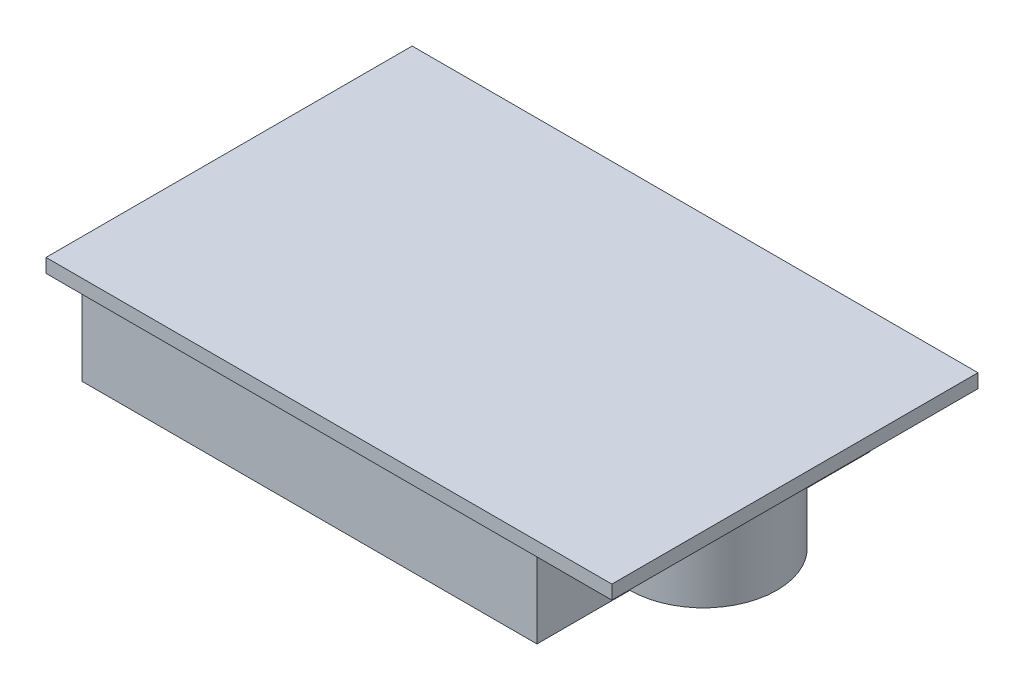
ISO-10303-21;
HEADER;
FILE_DESCRIPTION(('STEP AP214'),'2;1');
FILE_NAME('part.step','',(''),(''),'','','');
FILE_SCHEMA(('AUTOMOTIVE_DESIGN { 1 0 10303 214 1 1 1 1 }'));
ENDSEC;
DATA;
#1=APPLICATION_CONTEXT('core data for automotive mechanical design processes');
#2=APPLICATION_PROTOCOL_DEFINITION('international standard','automotive_design',2000,#1);
#3=PRODUCT_CONTEXT('',#1,'mechanical');
#4=PRODUCT('Part','Part','',(#3));
#5=PRODUCT_RELATED_PRODUCT_CATEGORY('part','',(#4));
#6=PRODUCT_DEFINITION_FORMATION('','',#4);
#7=PRODUCT_DEFINITION_CONTEXT('part definition',#1,'design');
#8=PRODUCT_DEFINITION('design','',#6,#7);
#9=PRODUCT_DEFINITION_SHAPE('','',#8);
#10=(LENGTH_UNIT() NAMED_UNIT(*) SI_UNIT(.MILLI.,.METRE.));
#11=(NAMED_UNIT(*) PLANE_ANGLE_UNIT() SI_UNIT($,.RADIAN.));
#12=(NAMED_UNIT(*) SI_UNIT($,.STERADIAN.) SOLID_ANGLE_UNIT());
#13=UNCERTAINTY_MEASURE_WITH_UNIT(LENGTH_MEASURE(1.E-05),#10,'distance_accuracy_value','');
#14=(GEOMETRIC_REPRESENTATION_CONTEXT(3) GLOBAL_UNCERTAINTY_ASSIGNED_CONTEXT((#13)) GLOBAL_UNIT_ASSIGNED_CONTEXT((#10,
#11,#12)) REPRESENTATION_CONTEXT('',''));
#15=CARTESIAN_POINT('',(0.,0.,0.));
#16=DIRECTION('',(0.,0.,1.));
#17=DIRECTION('',(1.,0.,0.));
#18=AXIS2_PLACEMENT_3D('',#15,#16,#17);
#19=CARTESIAN_POINT('',(-29.3159609120521,16.6,4.20195439739414));
#20=DIRECTION('',(1.,0.,0.));
#21=DIRECTION('',(0.,0.,-1.));
#22=AXIS2_PLACEMENT_3D('',#19,#20,#21);
#23=PLANE('',#22);
#24=DIRECTION('',(0.,0.,1.));
#25=VECTOR('',#24,1.);
#26=CARTESIAN_POINT('',(-29.3159609120521,0.,4.20195439739414));
#27=LINE('',#26,#25);
#28=CARTESIAN_POINT('',(-29.3159609120521,0.,-55.7980456026059));
#29=VERTEX_POINT('',#28);
#30=CARTESIAN_POINT('',(-29.3159609120521,0.,4.20195439739414));
#31=VERTEX_POINT('',#30);
#32=EDGE_CURVE('E136',#29,#31,#27,.T.);
#33=ORIENTED_EDGE('',*,*,#32,.T.);
#34=DIRECTION('',(0.,-1.,0.));
#35=VECTOR('',#34,1.);
#36=CARTESIAN_POINT('',(-29.3159609120521,16.6,4.20195439739414));
#37=LINE('',#36,#35);
#38=CARTESIAN_POINT('',(-29.3159609120521,16.6,4.20195439739414));
#39=VERTEX_POINT('',#38);
#40=EDGE_CURVE('E11',#39,#31,#37,.T.);
#41=ORIENTED_EDGE('',*,*,#40,.F.);
#42=DIRECTION('',(0.,0.,1.));
#43=VECTOR('',#42,1.);
#44=CARTESIAN_POINT('',(-29.3159609120521,16.6,4.20195439739414));
#45=LINE('',#44,#43);
#46=CARTESIAN_POINT('',(-29.3159609120521,16.6,-55.7980456026059));
#47=VERTEX_POINT('',#46);
#48=EDGE_CURVE('E128',#47,#39,#45,.T.);
#49=ORIENTED_EDGE('',*,*,#48,.F.);
#50=DIRECTION('',(0.,-1.,0.));
#51=VECTOR('',#50,1.);
#52=CARTESIAN_POINT('',(-29.3159609120521,16.6,-55.7980456026059));
#53=LINE('',#52,#51);
#54=EDGE_CURVE('E135',#47,#29,#53,.T.);
#55=ORIENTED_EDGE('',*,*,#54,.T.);
#56=EDGE_LOOP('',(#33,#41,#49,#55));
#57=FACE_BOUND('',#56,.T.);
#58=ADVANCED_FACE('F36',(#57),#23,.F.);
#59=CARTESIAN_POINT('',(-29.3159609120521,16.6,4.20195439739414));
#60=DIRECTION('',(0.,0.,-1.));
#61=DIRECTION('',(-1.,0.,0.));
#62=AXIS2_PLACEMENT_3D('',#59,#60,#61);
#63=PLANE('',#62);
#64=DIRECTION('',(1.,0.,0.));
#65=VECTOR('',#64,1.);
#66=CARTESIAN_POINT('',(-29.3159609120521,0.,4.20195439739414));
#67=LINE('',#66,#65);
#68=CARTESIAN_POINT('',(52.6840390879479,0.,4.20195439739414));
#69=VERTEX_POINT('',#68);
#70=EDGE_CURVE('E139',#31,#69,#67,.T.);
#71=ORIENTED_EDGE('',*,*,#70,.T.);
#72=DIRECTION('',(0.,-1.,0.));
#73=VECTOR('',#72,1.);
#74=CARTESIAN_POINT('',(52.6840390879479,16.6,4.20195439739414));
#75=LINE('',#74,#73);
#76=CARTESIAN_POINT('',(52.6840390879479,16.6,4.20195439739414));
#77=VERTEX_POINT('',#76);
#78=EDGE_CURVE('E43',#77,#69,#75,.T.);
#79=ORIENTED_EDGE('',*,*,#78,.F.);
#80=DIRECTION('',(1.,0.,0.));
#81=VECTOR('',#80,1.);
#82=CARTESIAN_POINT('',(-29.3159609120521,16.6,4.20195439739414));
#83=LINE('',#82,#81);
#84=EDGE_CURVE('E94',#39,#77,#83,.T.);
#85=ORIENTED_EDGE('',*,*,#84,.F.);
#86=ORIENTED_EDGE('',*,*,#40,.T.);
#87=EDGE_LOOP('',(#71,#79,#85,#86));
#88=FACE_BOUND('',#87,.T.);
#89=ADVANCED_FACE('F294',(#88),#63,.F.);
#90=CARTESIAN_POINT('',(52.6840390879479,16.6,-12.5480456026059));
#91=DIRECTION('',(-1.,0.,0.));
#92=DIRECTION('',(0.,0.,1.));
#93=AXIS2_PLACEMENT_3D('',#90,#91,#92);
#94=PLANE('',#93);
#95=DIRECTION('',(0.,0.,-1.));
#96=VECTOR('',#95,1.);
#97=CARTESIAN_POINT('',(52.6840390879479,0.,-12.5480456026059));
#98=LINE('',#97,#96);
#99=CARTESIAN_POINT('',(52.6840390879479,0.,-12.5480456026059));
#100=VERTEX_POINT('',#99);
#101=EDGE_CURVE('E110',#69,#100,#98,.T.);
#102=ORIENTED_EDGE('',*,*,#101,.T.);
#103=DIRECTION('',(0.,-1.,0.));
#104=VECTOR('',#103,1.);
#105=CARTESIAN_POINT('',(52.6840390879479,16.6,-12.5480456026059));
#106=LINE('',#105,#104);
#107=CARTESIAN_POINT('',(52.6840390879479,16.6,-12.5480456026059));
#108=VERTEX_POINT('',#107);
#109=EDGE_CURVE('E103',#108,#100,#106,.T.);
#110=ORIENTED_EDGE('',*,*,#109,.F.);
#111=DIRECTION('',(0.,0.,-1.));
#112=VECTOR('',#111,1.);
#113=CARTESIAN_POINT('',(52.6840390879479,16.6,-12.5480456026059));
#114=LINE('',#113,#112);
#115=EDGE_CURVE('E108',#77,#108,#114,.T.);
#116=ORIENTED_EDGE('',*,*,#115,.F.);
#117=ORIENTED_EDGE('',*,*,#78,.T.);
#118=EDGE_LOOP('',(#102,#110,#116,#117));
#119=FACE_BOUND('',#118,.T.);
#120=ADVANCED_FACE('F105',(#119),#94,.F.);
#121=CARTESIAN_POINT('',(52.6840390879479,16.6,-25.7980456026059));
#122=DIRECTION('',(0.,-1.,0.));
#123=DIRECTION('',(0.,0.,-1.));
#124=AXIS2_PLACEMENT_3D('',#121,#122,#123);
#125=CYLINDRICAL_SURFACE('',#124,13.25);
#126=CARTESIAN_POINT('',(52.6840390879479,0.,-25.7980456026059));
#127=DIRECTION('',(0.,1.,0.));
#128=DIRECTION('',(0.,0.,1.));
#129=AXIS2_PLACEMENT_3D('',#126,#127,#128);
#130=CIRCLE('',#129,13.25);
#131=CARTESIAN_POINT('',(52.6840390879479,0.,-39.0480456026059));
#132=VERTEX_POINT('',#131);
#133=EDGE_CURVE('E143',#100,#132,#130,.T.);
#134=ORIENTED_EDGE('',*,*,#133,.T.);
#135=DIRECTION('',(0.,-1.,0.));
#136=VECTOR('',#135,1.);
#137=CARTESIAN_POINT('',(52.6840390879479,16.6,-39.0480456026059));
#138=LINE('',#137,#136);
#139=CARTESIAN_POINT('',(52.6840390879479,16.6,-39.0480456026059));
#140=VERTEX_POINT('',#139);
#141=EDGE_CURVE('E113',#140,#132,#138,.T.);
#142=ORIENTED_EDGE('',*,*,#141,.F.);
#143=CARTESIAN_POINT('',(52.6840390879479,16.6,-25.7980456026059));
#144=DIRECTION('',(0.,1.,0.));
#145=DIRECTION('',(0.,0.,1.));
#146=AXIS2_PLACEMENT_3D('',#143,#144,#145);
#147=CIRCLE('',#146,13.25);
#148=EDGE_CURVE('E116',#108,#140,#147,.T.);
#149=ORIENTED_EDGE('',*,*,#148,.F.);
#150=ORIENTED_EDGE('',*,*,#109,.T.);
#151=EDGE_LOOP('',(#134,#142,#149,#150));
#152=FACE_BOUND('',#151,.T.);
#153=ADVANCED_FACE('F117',(#152),#125,.T.);
#154=CARTESIAN_POINT('',(52.6840390879479,16.6,-55.7980456026059));
#155=DIRECTION('',(-1.,0.,0.));
#156=DIRECTION('',(0.,0.,1.));
#157=AXIS2_PLACEMENT_3D('',#154,#155,#156);
#158=PLANE('',#157);
#159=DIRECTION('',(0.,0.,-1.));
#160=VECTOR('',#159,1.);
#161=CARTESIAN_POINT('',(52.6840390879479,0.,-55.7980456026059));
#162=LINE('',#161,#160);
#163=CARTESIAN_POINT('',(52.6840390879479,0.,-55.7980456026059));
#164=VERTEX_POINT('',#163);
#165=EDGE_CURVE('E145',#132,#164,#162,.T.);
#166=ORIENTED_EDGE('',*,*,#165,.T.);
#167=DIRECTION('',(0.,-1.,0.));
#168=VECTOR('',#167,1.);
#169=CARTESIAN_POINT('',(52.6840390879479,16.6,-55.7980456026059));
#170=LINE('',#169,#168);
#171=CARTESIAN_POINT('',(52.6840390879479,16.6,-55.7980456026059));
#172=VERTEX_POINT('',#171);
#173=EDGE_CURVE('E59',#172,#164,#170,.T.);
#174=ORIENTED_EDGE('',*,*,#173,.F.);
#175=DIRECTION('',(0.,0.,-1.));
#176=VECTOR('',#175,1.);
#177=CARTESIAN_POINT('',(52.6840390879479,16.6,-55.7980456026059));
#178=LINE('',#177,#176);
#179=EDGE_CURVE('E121',#140,#172,#178,.T.);
#180=ORIENTED_EDGE('',*,*,#179,.F.);
#181=ORIENTED_EDGE('',*,*,#141,.T.);
#182=EDGE_LOOP('',(#166,#174,#180,#181));
#183=FACE_BOUND('',#182,.T.);
#184=ADVANCED_FACE('F154',(#183),#158,.F.);
#185=CARTESIAN_POINT('',(-29.3159609120521,16.6,-55.7980456026059));
#186=DIRECTION('',(0.,0.,1.));
#187=DIRECTION('',(1.,0.,0.));
#188=AXIS2_PLACEMENT_3D('',#185,#186,#187);
#189=PLANE('',#188);
#190=DIRECTION('',(-1.,0.,0.));
#191=VECTOR('',#190,1.);
#192=CARTESIAN_POINT('',(-29.3159609120521,0.,-55.7980456026059));
#193=LINE('',#192,#191);
#194=EDGE_CURVE('E86',#164,#29,#193,.T.);
#195=ORIENTED_EDGE('',*,*,#194,.T.);
#196=ORIENTED_EDGE('',*,*,#54,.F.);
#197=DIRECTION('',(-1.,0.,0.));
#198=VECTOR('',#197,1.);
#199=CARTESIAN_POINT('',(-29.3159609120521,16.6,-55.7980456026059));
#200=LINE('',#199,#198);
#201=EDGE_CURVE('E133',#172,#47,#200,.T.);
#202=ORIENTED_EDGE('',*,*,#201,.F.);
#203=ORIENTED_EDGE('',*,*,#173,.T.);
#204=EDGE_LOOP('',(#195,#196,#202,#203));
#205=FACE_BOUND('',#204,.T.);
#206=ADVANCED_FACE('F157',(#205),#189,.F.);
#207=CARTESIAN_POINT('',(52.6840390879479,0.,-25.7980456026059));
#208=DIRECTION('',(0.,1.,0.));
#209=DIRECTION('',(0.,0.,1.));
#210=AXIS2_PLACEMENT_3D('',#207,#208,#209);
#211=PLANE('',#210);
#212=DIRECTION('',(1.,0.,0.));
#213=VECTOR('',#212,1.);
#214=CARTESIAN_POINT('',(-21.7678362246545,0.,-42.8510472899006));
#215=LINE('',#214,#213);
#216=CARTESIAN_POINT('',(-21.7678362246545,0.,-42.8510472899006));
#217=VERTEX_POINT('',#216);
#218=CARTESIAN_POINT('',(-2.15220219228129,0.,-42.8510472899006));
#219=VERTEX_POINT('',#218);
#220=EDGE_CURVE('E213',#217,#219,#215,.T.);
#221=ORIENTED_EDGE('',*,*,#220,.F.);
#222=DIRECTION('',(0.,0.,-1.));
#223=VECTOR('',#222,1.);
#224=CARTESIAN_POINT('',(-21.7678362246545,0.,-11.3977772317213));
#225=LINE('',#224,#223);
#226=CARTESIAN_POINT('',(-21.7678362246545,0.,-11.3977772317213));
#227=VERTEX_POINT('',#226);
#228=EDGE_CURVE('E50',#227,#217,#225,.T.);
#229=ORIENTED_EDGE('',*,*,#228,.F.);
#230=DIRECTION('',(-1.,0.,0.));
#231=VECTOR('',#230,1.);
#232=CARTESIAN_POINT('',(-21.7678362246545,0.,-11.3977772317213));
#233=LINE('',#232,#231);
#234=CARTESIAN_POINT('',(-2.15220219228129,0.,-11.3977772317213));
#235=VERTEX_POINT('',#234);
#236=EDGE_CURVE('E206',#235,#227,#233,.T.);
#237=ORIENTED_EDGE('',*,*,#236,.F.);
#238=DIRECTION('',(0.,0.,1.));
#239=VECTOR('',#238,1.);
#240=CARTESIAN_POINT('',(-2.15220219228129,0.,-11.3977772317213));
#241=LINE('',#240,#239);
#242=EDGE_CURVE('E210',#219,#235,#241,.T.);
#243=ORIENTED_EDGE('',*,*,#242,.F.);
#244=EDGE_LOOP('',(#221,#229,#237,#243));
#245=FACE_BOUND('',#244,.T.);
#246=ORIENTED_EDGE('',*,*,#32,.F.);
#247=ORIENTED_EDGE('',*,*,#194,.F.);
#248=ORIENTED_EDGE('',*,*,#165,.F.);
#249=ORIENTED_EDGE('',*,*,#133,.F.);
#250=ORIENTED_EDGE('',*,*,#101,.F.);
#251=ORIENTED_EDGE('',*,*,#70,.F.);
#252=EDGE_LOOP('',(#246,#247,#248,#249,#250,#251));
#253=FACE_BOUND('',#252,.T.);
#254=ADVANCED_FACE('F152',(#245,#253),#211,.F.);
#255=CARTESIAN_POINT('',(69.1840390879479,19.1,7.20195439739415));
#256=DIRECTION('',(0.,0.,-1.));
#257=DIRECTION('',(-1.,0.,0.));
#258=AXIS2_PLACEMENT_3D('',#255,#256,#257);
#259=PLANE('',#258);
#260=DIRECTION('',(1.,0.,0.));
#261=VECTOR('',#260,1.);
#262=CARTESIAN_POINT('',(69.1840390879479,16.6,7.20195439739415));
#263=LINE('',#262,#261);
#264=CARTESIAN_POINT('',(-32.8159609120521,16.6,7.20195439739415));
#265=VERTEX_POINT('',#264);
#266=CARTESIAN_POINT('',(69.1840390879479,16.6,7.20195439739415));
#267=VERTEX_POINT('',#266);
#268=EDGE_CURVE('E182',#265,#267,#263,.T.);
#269=ORIENTED_EDGE('',*,*,#268,.T.);
#270=DIRECTION('',(0.,-1.,0.));
#271=VECTOR('',#270,1.);
#272=CARTESIAN_POINT('',(69.1840390879479,19.1,7.20195439739415));
#273=LINE('',#272,#271);
#274=CARTESIAN_POINT('',(69.1840390879479,19.1,7.20195439739415));
#275=VERTEX_POINT('',#274);
#276=EDGE_CURVE('E140',#275,#267,#273,.T.);
#277=ORIENTED_EDGE('',*,*,#276,.F.);
#278=DIRECTION('',(1.,0.,0.));
#279=VECTOR('',#278,1.);
#280=CARTESIAN_POINT('',(69.1840390879479,19.1,7.20195439739415));
#281=LINE('',#280,#279);
#282=CARTESIAN_POINT('',(-32.8159609120521,19.1,7.20195439739415));
#283=VERTEX_POINT('',#282);
#284=EDGE_CURVE('E175',#283,#275,#281,.T.);
#285=ORIENTED_EDGE('',*,*,#284,.F.);
#286=DIRECTION('',(0.,-1.,0.));
#287=VECTOR('',#286,1.);
#288=CARTESIAN_POINT('',(-32.8159609120521,19.1,7.20195439739415));
#289=LINE('',#288,#287);
#290=EDGE_CURVE('E168',#283,#265,#289,.T.);
#291=ORIENTED_EDGE('',*,*,#290,.T.);
#292=EDGE_LOOP('',(#269,#277,#285,#291));
#293=FACE_BOUND('',#292,.T.);
#294=ADVANCED_FACE('F275',(#293),#259,.F.);
#295=CARTESIAN_POINT('',(69.1840390879479,19.1,-58.7980456026059));
#296=DIRECTION('',(-1.,0.,0.));
#297=DIRECTION('',(0.,0.,1.));
#298=AXIS2_PLACEMENT_3D('',#295,#296,#297);
#299=PLANE('',#298);
#300=DIRECTION('',(0.,0.,-1.));
#301=VECTOR('',#300,1.);
#302=CARTESIAN_POINT('',(69.1840390879479,16.6,-58.7980456026059));
#303=LINE('',#302,#301);
#304=CARTESIAN_POINT('',(69.1840390879479,16.6,-58.7980456026059));
#305=VERTEX_POINT('',#304);
#306=EDGE_CURVE('E179',#267,#305,#303,.T.);
#307=ORIENTED_EDGE('',*,*,#306,.T.);
#308=DIRECTION('',(0.,-1.,0.));
#309=VECTOR('',#308,1.);
#310=CARTESIAN_POINT('',(69.1840390879479,19.1,-58.7980456026059));
#311=LINE('',#310,#309);
#312=CARTESIAN_POINT('',(69.1840390879479,19.1,-58.7980456026059));
#313=VERTEX_POINT('',#312);
#314=EDGE_CURVE('E162',#313,#305,#311,.T.);
#315=ORIENTED_EDGE('',*,*,#314,.F.);
#316=DIRECTION('',(0.,0.,-1.));
#317=VECTOR('',#316,1.);
#318=CARTESIAN_POINT('',(69.1840390879479,19.1,-58.7980456026059));
#319=LINE('',#318,#317);
#320=EDGE_CURVE('E191',#275,#313,#319,.T.);
#321=ORIENTED_EDGE('',*,*,#320,.F.);
#322=ORIENTED_EDGE('',*,*,#276,.T.);
#323=EDGE_LOOP('',(#307,#315,#321,#322));
#324=FACE_BOUND('',#323,.T.);
#325=ADVANCED_FACE('F279',(#324),#299,.F.);
#326=CARTESIAN_POINT('',(-32.8159609120521,19.1,-58.7980456026059));
#327=DIRECTION('',(0.,0.,1.));
#328=DIRECTION('',(1.,0.,0.));
#329=AXIS2_PLACEMENT_3D('',#326,#327,#328);
#330=PLANE('',#329);
#331=DIRECTION('',(-1.,0.,0.));
#332=VECTOR('',#331,1.);
#333=CARTESIAN_POINT('',(-32.8159609120521,16.6,-58.7980456026059));
#334=LINE('',#333,#332);
#335=CARTESIAN_POINT('',(-32.8159609120521,16.6,-58.7980456026059));
#336=VERTEX_POINT('',#335);
#337=EDGE_CURVE('E176',#305,#336,#334,.T.);
#338=ORIENTED_EDGE('',*,*,#337,.T.);
#339=DIRECTION('',(0.,-1.,0.));
#340=VECTOR('',#339,1.);
#341=CARTESIAN_POINT('',(-32.8159609120521,19.1,-58.7980456026059));
#342=LINE('',#341,#340);
#343=CARTESIAN_POINT('',(-32.8159609120521,19.1,-58.7980456026059));
#344=VERTEX_POINT('',#343);
#345=EDGE_CURVE('E165',#344,#336,#342,.T.);
#346=ORIENTED_EDGE('',*,*,#345,.F.);
#347=DIRECTION('',(-1.,0.,0.));
#348=VECTOR('',#347,1.);
#349=CARTESIAN_POINT('',(-32.8159609120521,19.1,-58.7980456026059));
#350=LINE('',#349,#348);
#351=EDGE_CURVE('E188',#313,#344,#350,.T.);
#352=ORIENTED_EDGE('',*,*,#351,.F.);
#353=ORIENTED_EDGE('',*,*,#314,.T.);
#354=EDGE_LOOP('',(#338,#346,#352,#353));
#355=FACE_BOUND('',#354,.T.);
#356=ADVANCED_FACE('F284',(#355),#330,.F.);
#357=CARTESIAN_POINT('',(-32.8159609120521,19.1,7.20195439739415));
#358=DIRECTION('',(1.,0.,0.));
#359=DIRECTION('',(0.,0.,-1.));
#360=AXIS2_PLACEMENT_3D('',#357,#358,#359);
#361=PLANE('',#360);
#362=DIRECTION('',(0.,0.,1.));
#363=VECTOR('',#362,1.);
#364=CARTESIAN_POINT('',(-32.8159609120521,16.6,7.20195439739415));
#365=LINE('',#364,#363);
#366=EDGE_CURVE('E172',#336,#265,#365,.T.);
#367=ORIENTED_EDGE('',*,*,#366,.T.);
#368=ORIENTED_EDGE('',*,*,#290,.F.);
#369=DIRECTION('',(0.,0.,1.));
#370=VECTOR('',#369,1.);
#371=CARTESIAN_POINT('',(-32.8159609120521,19.1,7.20195439739415));
#372=LINE('',#371,#370);
#373=EDGE_CURVE('E171',#344,#283,#372,.T.);
#374=ORIENTED_EDGE('',*,*,#373,.F.);
#375=ORIENTED_EDGE('',*,*,#345,.T.);
#376=EDGE_LOOP('',(#367,#368,#374,#375));
#377=FACE_BOUND('',#376,.T.);
#378=ADVANCED_FACE('F268',(#377),#361,.F.);
#379=CARTESIAN_POINT('',(0.,19.1,0.));
#380=DIRECTION('',(0.,-1.,0.));
#381=DIRECTION('',(0.,0.,-1.));
#382=AXIS2_PLACEMENT_3D('',#379,#380,#381);
#383=PLANE('',#382);
#384=ORIENTED_EDGE('',*,*,#284,.T.);
#385=ORIENTED_EDGE('',*,*,#320,.T.);
#386=ORIENTED_EDGE('',*,*,#351,.T.);
#387=ORIENTED_EDGE('',*,*,#373,.T.);
#388=EDGE_LOOP('',(#384,#385,#386,#387));
#389=FACE_BOUND('',#388,.T.);
#390=ADVANCED_FACE('F282',(#389),#383,.F.);
#391=CARTESIAN_POINT('',(0.,16.6,0.));
#392=DIRECTION('',(0.,-1.,0.));
#393=DIRECTION('',(0.,0.,-1.));
#394=AXIS2_PLACEMENT_3D('',#391,#392,#393);
#395=PLANE('',#394);
#396=ORIENTED_EDGE('',*,*,#201,.T.);
#397=ORIENTED_EDGE('',*,*,#48,.T.);
#398=ORIENTED_EDGE('',*,*,#84,.T.);
#399=ORIENTED_EDGE('',*,*,#115,.T.);
#400=ORIENTED_EDGE('',*,*,#148,.T.);
#401=ORIENTED_EDGE('',*,*,#179,.T.);
#402=EDGE_LOOP('',(#396,#397,#398,#399,#400,#401));
#403=FACE_BOUND('',#402,.T.);
#404=ORIENTED_EDGE('',*,*,#268,.F.);
#405=ORIENTED_EDGE('',*,*,#366,.F.);
#406=ORIENTED_EDGE('',*,*,#337,.F.);
#407=ORIENTED_EDGE('',*,*,#306,.F.);
#408=EDGE_LOOP('',(#404,#405,#406,#407));
#409=FACE_BOUND('',#408,.T.);
#410=ADVANCED_FACE('F124',(#403,#409),#395,.T.);
#411=CARTESIAN_POINT('',(-21.7678362246545,12.5,-11.3977772317213));
#412=DIRECTION('',(-1.,0.,0.));
#413=DIRECTION('',(0.,0.,1.));
#414=AXIS2_PLACEMENT_3D('',#411,#412,#413);
#415=PLANE('',#414);
#416=ORIENTED_EDGE('',*,*,#228,.T.);
#417=DIRECTION('',(0.,-1.,0.));
#418=VECTOR('',#417,1.);
#419=CARTESIAN_POINT('',(-21.7678362246545,12.5,-42.8510472899006));
#420=LINE('',#419,#418);
#421=CARTESIAN_POINT('',(-21.7678362246545,12.5,-42.8510472899006));
#422=VERTEX_POINT('',#421);
#423=EDGE_CURVE('E196',#422,#217,#420,.T.);
#424=ORIENTED_EDGE('',*,*,#423,.F.);
#425=DIRECTION('',(0.,0.,-1.));
#426=VECTOR('',#425,1.);
#427=CARTESIAN_POINT('',(-21.7678362246545,12.5,-11.3977772317213));
#428=LINE('',#427,#426);
#429=CARTESIAN_POINT('',(-21.7678362246545,12.5,-11.3977772317213));
#430=VERTEX_POINT('',#429);
#431=EDGE_CURVE('E209',#430,#422,#428,.T.);
#432=ORIENTED_EDGE('',*,*,#431,.F.);
#433=DIRECTION('',(0.,-1.,0.));
#434=VECTOR('',#433,1.);
#435=CARTESIAN_POINT('',(-21.7678362246545,12.5,-11.3977772317213));
#436=LINE('',#435,#434);
#437=EDGE_CURVE('E185',#430,#227,#436,.T.);
#438=ORIENTED_EDGE('',*,*,#437,.T.);
#439=EDGE_LOOP('',(#416,#424,#432,#438));
#440=FACE_BOUND('',#439,.T.);
#441=ADVANCED_FACE('F236',(#440),#415,.F.);
#442=CARTESIAN_POINT('',(-21.7678362246545,12.5,-11.3977772317213));
#443=DIRECTION('',(0.,0.,1.));
#444=DIRECTION('',(1.,0.,0.));
#445=AXIS2_PLACEMENT_3D('',#442,#443,#444);
#446=PLANE('',#445);
#447=ORIENTED_EDGE('',*,*,#236,.T.);
#448=ORIENTED_EDGE('',*,*,#437,.F.);
#449=DIRECTION('',(-1.,0.,0.));
#450=VECTOR('',#449,1.);
#451=CARTESIAN_POINT('',(-21.7678362246545,12.5,-11.3977772317213));
#452=LINE('',#451,#450);
#453=CARTESIAN_POINT('',(-2.15220219228129,12.5,-11.3977772317213));
#454=VERTEX_POINT('',#453);
#455=EDGE_CURVE('E199',#454,#430,#452,.T.);
#456=ORIENTED_EDGE('',*,*,#455,.F.);
#457=DIRECTION('',(0.,-1.,0.));
#458=VECTOR('',#457,1.);
#459=CARTESIAN_POINT('',(-2.15220219228129,12.5,-11.3977772317213));
#460=LINE('',#459,#458);
#461=EDGE_CURVE('E202',#454,#235,#460,.T.);
#462=ORIENTED_EDGE('',*,*,#461,.T.);
#463=EDGE_LOOP('',(#447,#448,#456,#462));
#464=FACE_BOUND('',#463,.T.);
#465=ADVANCED_FACE('F362',(#464),#446,.F.);
#466=CARTESIAN_POINT('',(-2.15220219228129,12.5,-11.3977772317213));
#467=DIRECTION('',(1.,0.,0.));
#468=DIRECTION('',(0.,0.,-1.));
#469=AXIS2_PLACEMENT_3D('',#466,#467,#468);
#470=PLANE('',#469);
#471=ORIENTED_EDGE('',*,*,#242,.T.);
#472=ORIENTED_EDGE('',*,*,#461,.F.);
#473=DIRECTION('',(0.,0.,1.));
#474=VECTOR('',#473,1.);
#475=CARTESIAN_POINT('',(-2.15220219228129,12.5,-11.3977772317213));
#476=LINE('',#475,#474);
#477=CARTESIAN_POINT('',(-2.15220219228129,12.5,-42.8510472899006));
#478=VERTEX_POINT('',#477);
#479=EDGE_CURVE('E219',#478,#454,#476,.T.);
#480=ORIENTED_EDGE('',*,*,#479,.F.);
#481=DIRECTION('',(0.,-1.,0.));
#482=VECTOR('',#481,1.);
#483=CARTESIAN_POINT('',(-2.15220219228129,12.5,-42.8510472899006));
#484=LINE('',#483,#482);
#485=EDGE_CURVE('E198',#478,#219,#484,.T.);
#486=ORIENTED_EDGE('',*,*,#485,.T.);
#487=EDGE_LOOP('',(#471,#472,#480,#486));
#488=FACE_BOUND('',#487,.T.);
#489=ADVANCED_FACE('F371',(#488),#470,.F.);
#490=CARTESIAN_POINT('',(-21.7678362246545,12.5,-42.8510472899006));
#491=DIRECTION('',(0.,0.,-1.));
#492=DIRECTION('',(-1.,0.,0.));
#493=AXIS2_PLACEMENT_3D('',#490,#491,#492);
#494=PLANE('',#493);
#495=ORIENTED_EDGE('',*,*,#220,.T.);
#496=ORIENTED_EDGE('',*,*,#485,.F.);
#497=DIRECTION('',(1.,0.,0.));
#498=VECTOR('',#497,1.);
#499=CARTESIAN_POINT('',(-21.7678362246545,12.5,-42.8510472899006));
#500=LINE('',#499,#498);
#501=EDGE_CURVE('E222',#422,#478,#500,.T.);
#502=ORIENTED_EDGE('',*,*,#501,.F.);
#503=ORIENTED_EDGE('',*,*,#423,.T.);
#504=EDGE_LOOP('',(#495,#496,#502,#503));
#505=FACE_BOUND('',#504,.T.);
#506=ADVANCED_FACE('F380',(#505),#494,.F.);
#507=CARTESIAN_POINT('',(0.,12.5,0.));
#508=DIRECTION('',(0.,-1.,0.));
#509=DIRECTION('',(0.,0.,-1.));
#510=AXIS2_PLACEMENT_3D('',#507,#508,#509);
#511=PLANE('',#510);
#512=ORIENTED_EDGE('',*,*,#431,.T.);
#513=ORIENTED_EDGE('',*,*,#501,.T.);
#514=ORIENTED_EDGE('',*,*,#479,.T.);
#515=ORIENTED_EDGE('',*,*,#455,.T.);
#516=EDGE_LOOP('',(#512,#513,#514,#515));
#517=FACE_BOUND('',#516,.T.);
#518=ADVANCED_FACE('F229',(#517),#511,.T.);
#519=CLOSED_SHELL('',(#58,#89,#120,#153,#184,#206,#254,#294,#325,#356,#378,#390,#410,#441,#465,
#489,#506,#518));
#520=MANIFOLD_SOLID_BREP('B2',#519);
#521=ADVANCED_BREP_SHAPE_REPRESENTATION('',(#18,#520),#14);
#522=SHAPE_DEFINITION_REPRESENTATION(#9,#521);
ENDSEC;
END-ISO-10303-21;
